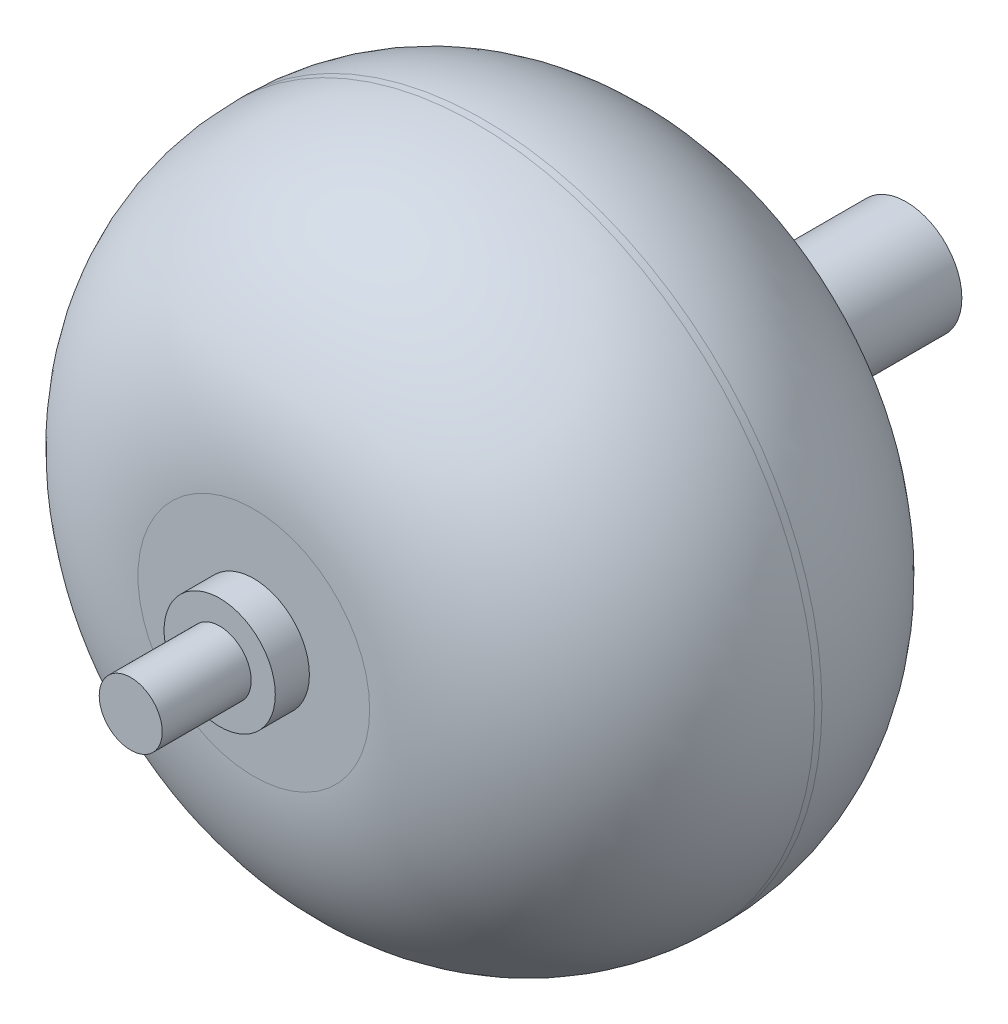
ISO-10303-21;
HEADER;
FILE_DESCRIPTION(('STEP AP214'),'2;1');
FILE_NAME('part.step','',(''),(''),'','','');
FILE_SCHEMA(('AUTOMOTIVE_DESIGN { 1 0 10303 214 1 1 1 1 }'));
ENDSEC;
DATA;
#1=APPLICATION_CONTEXT('core data for automotive mechanical design processes');
#2=APPLICATION_PROTOCOL_DEFINITION('international standard','automotive_design',2000,#1);
#3=PRODUCT_CONTEXT('',#1,'mechanical');
#4=PRODUCT('Part','Part','',(#3));
#5=PRODUCT_RELATED_PRODUCT_CATEGORY('part','',(#4));
#6=PRODUCT_DEFINITION_FORMATION('','',#4);
#7=PRODUCT_DEFINITION_CONTEXT('part definition',#1,'design');
#8=PRODUCT_DEFINITION('design','',#6,#7);
#9=PRODUCT_DEFINITION_SHAPE('','',#8);
#10=(LENGTH_UNIT() NAMED_UNIT(*) SI_UNIT(.MILLI.,.METRE.));
#11=(NAMED_UNIT(*) PLANE_ANGLE_UNIT() SI_UNIT($,.RADIAN.));
#12=(NAMED_UNIT(*) SI_UNIT($,.STERADIAN.) SOLID_ANGLE_UNIT());
#13=UNCERTAINTY_MEASURE_WITH_UNIT(LENGTH_MEASURE(1.E-05),#10,'distance_accuracy_value','');
#14=(GEOMETRIC_REPRESENTATION_CONTEXT(3) GLOBAL_UNCERTAINTY_ASSIGNED_CONTEXT((#13)) GLOBAL_UNIT_ASSIGNED_CONTEXT((#10,
#11,#12)) REPRESENTATION_CONTEXT('',''));
#15=CARTESIAN_POINT('',(0.,0.,0.));
#16=DIRECTION('',(0.,0.,1.));
#17=DIRECTION('',(1.,0.,0.));
#18=AXIS2_PLACEMENT_3D('',#15,#16,#17);
#19=CARTESIAN_POINT('',(0.,0.,12.2));
#20=DIRECTION('',(0.,0.,-1.));
#21=DIRECTION('',(-1.,0.,0.));
#22=AXIS2_PLACEMENT_3D('',#19,#20,#21);
#23=CYLINDRICAL_SURFACE('',#22,9.125);
#24=CARTESIAN_POINT('',(0.,0.,6.2));
#25=DIRECTION('',(0.,0.,1.));
#26=DIRECTION('',(1.,0.,0.));
#27=AXIS2_PLACEMENT_3D('',#24,#25,#26);
#28=CIRCLE('',#27,9.125);
#29=CARTESIAN_POINT('',(9.125,0.,6.2));
#30=VERTEX_POINT('',#29);
#31=EDGE_CURVE('E47',#30,#30,#28,.F.);
#32=ORIENTED_EDGE('',*,*,#31,.T.);
#33=EDGE_LOOP('',(#32));
#34=FACE_BOUND('',#33,.T.);
#35=CARTESIAN_POINT('',(0.,0.,6.));
#36=DIRECTION('',(0.,0.,1.));
#37=DIRECTION('',(1.,0.,0.));
#38=AXIS2_PLACEMENT_3D('',#35,#36,#37);
#39=CIRCLE('',#38,9.125);
#40=CARTESIAN_POINT('',(9.125,0.,6.));
#41=VERTEX_POINT('',#40);
#42=EDGE_CURVE('E51',#41,#41,#39,.T.);
#43=ORIENTED_EDGE('',*,*,#42,.T.);
#44=EDGE_LOOP('',(#43));
#45=FACE_BOUND('',#44,.T.);
#46=ADVANCED_FACE('F40',(#34,#45),#23,.T.);
#47=CARTESIAN_POINT('',(0.,0.,12.2));
#48=DIRECTION('',(0.,0.,1.));
#49=DIRECTION('',(1.,0.,0.));
#50=AXIS2_PLACEMENT_3D('',#47,#48,#49);
#51=PLANE('',#50);
#52=CARTESIAN_POINT('',(0.,0.,12.2));
#53=DIRECTION('',(0.,0.,1.));
#54=DIRECTION('',(1.,0.,0.));
#55=AXIS2_PLACEMENT_3D('',#52,#53,#54);
#56=CIRCLE('',#55,3.125);
#57=CARTESIAN_POINT('',(3.125,0.,12.2));
#58=VERTEX_POINT('',#57);
#59=EDGE_CURVE('E55',#58,#58,#56,.T.);
#60=ORIENTED_EDGE('',*,*,#59,.T.);
#61=EDGE_LOOP('',(#60));
#62=FACE_BOUND('',#61,.T.);
#63=CARTESIAN_POINT('',(0.,0.,12.2));
#64=DIRECTION('',(0.,0.,1.));
#65=DIRECTION('',(1.,0.,0.));
#66=AXIS2_PLACEMENT_3D('',#63,#64,#65);
#67=CIRCLE('',#66,1.5);
#68=CARTESIAN_POINT('',(1.5,0.,12.2));
#69=VERTEX_POINT('',#68);
#70=EDGE_CURVE('E60',#69,#69,#67,.T.);
#71=ORIENTED_EDGE('',*,*,#70,.F.);
#72=EDGE_LOOP('',(#71));
#73=FACE_BOUND('',#72,.T.);
#74=ADVANCED_FACE('F97',(#62,#73),#51,.T.);
#75=CARTESIAN_POINT('',(0.,0.,0.));
#76=DIRECTION('',(0.,0.,1.));
#77=DIRECTION('',(1.,0.,0.));
#78=AXIS2_PLACEMENT_3D('',#75,#76,#77);
#79=PLANE('',#78);
#80=CARTESIAN_POINT('',(0.,0.,0.));
#81=DIRECTION('',(0.,0.,1.));
#82=DIRECTION('',(1.,0.,0.));
#83=AXIS2_PLACEMENT_3D('',#80,#81,#82);
#84=CIRCLE('',#83,3.125);
#85=CARTESIAN_POINT('',(3.125,0.,0.));
#86=VERTEX_POINT('',#85);
#87=EDGE_CURVE('E10',#86,#86,#84,.F.);
#88=ORIENTED_EDGE('',*,*,#87,.T.);
#89=EDGE_LOOP('',(#88));
#90=FACE_BOUND('',#89,.T.);
#91=CARTESIAN_POINT('',(0.,0.,0.));
#92=DIRECTION('',(0.,0.,-1.));
#93=DIRECTION('',(-1.,0.,0.));
#94=AXIS2_PLACEMENT_3D('',#91,#92,#93);
#95=CIRCLE('',#94,1.5);
#96=CARTESIAN_POINT('',(1.5,0.,0.));
#97=VERTEX_POINT('',#96);
#98=EDGE_CURVE('E66',#97,#97,#95,.T.);
#99=ORIENTED_EDGE('',*,*,#98,.F.);
#100=EDGE_LOOP('',(#99));
#101=FACE_BOUND('',#100,.T.);
#102=ADVANCED_FACE('F103',(#90,#101),#79,.F.);
#103=CARTESIAN_POINT('',(0.,0.,-5.4));
#104=DIRECTION('',(0.,0.,1.));
#105=DIRECTION('',(1.,0.,0.));
#106=AXIS2_PLACEMENT_3D('',#103,#104,#105);
#107=CYLINDRICAL_SURFACE('',#106,1.5);
#108=CARTESIAN_POINT('',(0.,0.,-5.4));
#109=DIRECTION('',(0.,0.,-1.));
#110=DIRECTION('',(-1.,0.,0.));
#111=AXIS2_PLACEMENT_3D('',#108,#109,#110);
#112=CIRCLE('',#111,1.5);
#113=CARTESIAN_POINT('',(1.5,0.,-5.4));
#114=VERTEX_POINT('',#113);
#115=EDGE_CURVE('E69',#114,#114,#112,.T.);
#116=CARTESIAN_POINT('',(1.5,0.,-5.4));
#117=CARTESIAN_POINT('',(1.5,0.,-5.34375));
#118=CARTESIAN_POINT('',(1.5,0.,-5.2875));
#119=CARTESIAN_POINT('',(1.5,0.,-5.175));
#120=CARTESIAN_POINT('',(1.5,0.,-5.11875));
#121=CARTESIAN_POINT('',(1.5,0.,-5.00625));
#122=CARTESIAN_POINT('',(1.5,0.,-4.95));
#123=CARTESIAN_POINT('',(1.5,0.,-4.8375));
#124=CARTESIAN_POINT('',(1.5,0.,-4.78125));
#125=CARTESIAN_POINT('',(1.5,0.,-4.66875));
#126=CARTESIAN_POINT('',(1.5,0.,-4.6125));
#127=CARTESIAN_POINT('',(1.5,0.,-4.5));
#128=CARTESIAN_POINT('',(1.5,0.,-4.44375));
#129=CARTESIAN_POINT('',(1.5,0.,-4.33125));
#130=CARTESIAN_POINT('',(1.5,0.,-4.275));
#131=CARTESIAN_POINT('',(1.5,0.,-4.1625));
#132=CARTESIAN_POINT('',(1.5,0.,-4.10625));
#133=CARTESIAN_POINT('',(1.5,0.,-3.99375));
#134=CARTESIAN_POINT('',(1.5,0.,-3.9375));
#135=CARTESIAN_POINT('',(1.5,0.,-3.825));
#136=CARTESIAN_POINT('',(1.5,0.,-3.76875));
#137=CARTESIAN_POINT('',(1.5,0.,-3.65625));
#138=CARTESIAN_POINT('',(1.5,0.,-3.6));
#139=CARTESIAN_POINT('',(1.5,0.,-3.4875));
#140=CARTESIAN_POINT('',(1.5,0.,-3.43125));
#141=CARTESIAN_POINT('',(1.5,0.,-3.31875));
#142=CARTESIAN_POINT('',(1.5,0.,-3.2625));
#143=CARTESIAN_POINT('',(1.5,0.,-3.15));
#144=CARTESIAN_POINT('',(1.5,0.,-3.09375));
#145=CARTESIAN_POINT('',(1.5,0.,-2.98125));
#146=CARTESIAN_POINT('',(1.5,0.,-2.925));
#147=CARTESIAN_POINT('',(1.5,0.,-2.8125));
#148=CARTESIAN_POINT('',(1.5,0.,-2.75625));
#149=CARTESIAN_POINT('',(1.5,0.,-2.64375));
#150=CARTESIAN_POINT('',(1.5,0.,-2.5875));
#151=CARTESIAN_POINT('',(1.5,0.,-2.475));
#152=CARTESIAN_POINT('',(1.5,0.,-2.41875));
#153=CARTESIAN_POINT('',(1.5,0.,-2.30625));
#154=CARTESIAN_POINT('',(1.5,0.,-2.25));
#155=CARTESIAN_POINT('',(1.5,0.,-2.1375));
#156=CARTESIAN_POINT('',(1.5,0.,-2.08125));
#157=CARTESIAN_POINT('',(1.5,0.,-1.96875));
#158=CARTESIAN_POINT('',(1.5,0.,-1.9125));
#159=CARTESIAN_POINT('',(1.5,0.,-1.8));
#160=CARTESIAN_POINT('',(1.5,0.,-1.74375));
#161=CARTESIAN_POINT('',(1.5,0.,-1.63125));
#162=CARTESIAN_POINT('',(1.5,0.,-1.575));
#163=CARTESIAN_POINT('',(1.5,0.,-1.4625));
#164=CARTESIAN_POINT('',(1.5,0.,-1.40625));
#165=CARTESIAN_POINT('',(1.5,0.,-1.29375));
#166=CARTESIAN_POINT('',(1.5,0.,-1.2375));
#167=CARTESIAN_POINT('',(1.5,0.,-1.125));
#168=CARTESIAN_POINT('',(1.5,0.,-1.06875));
#169=CARTESIAN_POINT('',(1.5,0.,-0.95625));
#170=CARTESIAN_POINT('',(1.5,0.,-0.9));
#171=CARTESIAN_POINT('',(1.5,0.,-0.7875));
#172=CARTESIAN_POINT('',(1.5,0.,-0.73125));
#173=CARTESIAN_POINT('',(1.5,0.,-0.618749999999999));
#174=CARTESIAN_POINT('',(1.5,0.,-0.562499999999999));
#175=CARTESIAN_POINT('',(1.5,0.,-0.449999999999999));
#176=CARTESIAN_POINT('',(1.5,0.,-0.393749999999999));
#177=CARTESIAN_POINT('',(1.5,0.,-0.281249999999999));
#178=CARTESIAN_POINT('',(1.5,0.,-0.225));
#179=CARTESIAN_POINT('',(1.5,0.,-0.112499999999999));
#180=CARTESIAN_POINT('',(1.5,0.,-0.0562499999999992));
#181=CARTESIAN_POINT('',(1.5,0.,0.));
#182=B_SPLINE_CURVE_WITH_KNOTS('',3,(#116,#117,#118,#119,#120,#121,#122,#123,#124,#125,#126,
#127,#128,#129,#130,#131,#132,#133,#134,#135,#136,#137,#138,#139,#140,#141,#142,#143,#144,#145,
#146,#147,#148,#149,#150,#151,#152,#153,#154,#155,#156,#157,#158,#159,#160,#161,#162,#163,#164,
#165,#166,#167,#168,#169,#170,#171,#172,#173,#174,#175,#176,#177,#178,#179,#180,#181),
.UNSPECIFIED.,.F.,.F.,(4,2,2,2,2,2,2,2,2,2,2,2,2,2,2,2,2,2,2,2,2,2,2,2,2,2,2,2,2,2,2,2,4),(0.,
0.168750000000001,0.3375,0.506250000000001,0.675,0.843750000000001,1.0125,1.18125,1.35,1.51875,
1.6875,1.85625,2.025,2.19375,2.3625,2.53125,2.7,2.86875,3.0375,3.20625,3.375,3.54375,3.7125,
3.88125,4.05,4.21875,4.3875,4.55625,4.725,4.89375,5.0625,5.23125,5.4),.UNSPECIFIED.);
#183=EDGE_CURVE('BSEAM126',#114,#97,#182,.T.);
#184=ORIENTED_EDGE('',*,*,#115,.F.);
#185=ORIENTED_EDGE('',*,*,#98,.T.);
#186=ORIENTED_EDGE('',*,*,#183,.T.);
#187=ORIENTED_EDGE('',*,*,#183,.F.);
#188=EDGE_LOOP('',(#184,#186,#185,#187));
#189=FACE_BOUND('',#188,.T.);
#190=ADVANCED_FACE('F126',(#189),#107,.T.);
#191=CARTESIAN_POINT('',(0.,0.,-5.4));
#192=DIRECTION('',(0.,0.,-1.));
#193=DIRECTION('',(-1.,0.,0.));
#194=AXIS2_PLACEMENT_3D('',#191,#192,#193);
#195=PLANE('',#194);
#196=ORIENTED_EDGE('',*,*,#115,.T.);
#197=EDGE_LOOP('',(#196));
#198=FACE_BOUND('',#197,.T.);
#199=ADVANCED_FACE('F120',(#198),#195,.T.);
#200=CARTESIAN_POINT('',(0.,0.,13.12));
#201=DIRECTION('',(0.,0.,-1.));
#202=DIRECTION('',(-1.,0.,0.));
#203=AXIS2_PLACEMENT_3D('',#200,#201,#202);
#204=CYLINDRICAL_SURFACE('',#203,1.5);
#205=CARTESIAN_POINT('',(0.,0.,13.12));
#206=DIRECTION('',(0.,0.,1.));
#207=DIRECTION('',(1.,0.,0.));
#208=AXIS2_PLACEMENT_3D('',#205,#206,#207);
#209=CIRCLE('',#208,1.5);
#210=CARTESIAN_POINT('',(1.5,0.,13.12));
#211=VERTEX_POINT('',#210);
#212=EDGE_CURVE('E64',#211,#211,#209,.T.);
#213=ORIENTED_EDGE('',*,*,#212,.F.);
#214=EDGE_LOOP('',(#213));
#215=FACE_BOUND('',#214,.T.);
#216=ORIENTED_EDGE('',*,*,#70,.T.);
#217=EDGE_LOOP('',(#216));
#218=FACE_BOUND('',#217,.T.);
#219=ADVANCED_FACE('F92',(#215,#218),#204,.T.);
#220=CARTESIAN_POINT('',(0.,0.,13.12));
#221=DIRECTION('',(0.,0.,1.));
#222=DIRECTION('',(1.,0.,0.));
#223=AXIS2_PLACEMENT_3D('',#220,#221,#222);
#224=PLANE('',#223);
#225=CARTESIAN_POINT('',(0.,0.,13.12));
#226=DIRECTION('',(0.,0.,1.));
#227=DIRECTION('',(1.,0.,0.));
#228=AXIS2_PLACEMENT_3D('',#225,#226,#227);
#229=CIRCLE('',#228,0.85);
#230=CARTESIAN_POINT('',(-0.85,0.,13.12));
#231=VERTEX_POINT('',#230);
#232=EDGE_CURVE('E61',#231,#231,#229,.F.);
#233=ORIENTED_EDGE('',*,*,#232,.T.);
#234=EDGE_LOOP('',(#233));
#235=FACE_BOUND('',#234,.T.);
#236=ORIENTED_EDGE('',*,*,#212,.T.);
#237=EDGE_LOOP('',(#236));
#238=FACE_BOUND('',#237,.T.);
#239=ADVANCED_FACE('F83',(#235,#238),#224,.T.);
#240=CARTESIAN_POINT('',(0.,0.,15.52));
#241=DIRECTION('',(0.,0.,-1.));
#242=DIRECTION('',(-1.,0.,0.));
#243=AXIS2_PLACEMENT_3D('',#240,#241,#242);
#244=CYLINDRICAL_SURFACE('',#243,0.85);
#245=CARTESIAN_POINT('',(0.,0.,15.52));
#246=DIRECTION('',(0.,0.,1.));
#247=DIRECTION('',(1.,0.,0.));
#248=AXIS2_PLACEMENT_3D('',#245,#246,#247);
#249=CIRCLE('',#248,0.85);
#250=CARTESIAN_POINT('',(-0.85,0.,15.52));
#251=VERTEX_POINT('',#250);
#252=EDGE_CURVE('E65',#251,#251,#249,.T.);
#253=CARTESIAN_POINT('',(-0.85,0.,13.12));
#254=CARTESIAN_POINT('',(-0.85,0.,13.145));
#255=CARTESIAN_POINT('',(-0.85,0.,13.17));
#256=CARTESIAN_POINT('',(-0.85,0.,13.22));
#257=CARTESIAN_POINT('',(-0.85,0.,13.245));
#258=CARTESIAN_POINT('',(-0.85,0.,13.295));
#259=CARTESIAN_POINT('',(-0.85,0.,13.32));
#260=CARTESIAN_POINT('',(-0.85,0.,13.37));
#261=CARTESIAN_POINT('',(-0.85,0.,13.395));
#262=CARTESIAN_POINT('',(-0.85,0.,13.445));
#263=CARTESIAN_POINT('',(-0.85,0.,13.47));
#264=CARTESIAN_POINT('',(-0.85,0.,13.52));
#265=CARTESIAN_POINT('',(-0.85,0.,13.545));
#266=CARTESIAN_POINT('',(-0.85,0.,13.595));
#267=CARTESIAN_POINT('',(-0.85,0.,13.62));
#268=CARTESIAN_POINT('',(-0.85,0.,13.67));
#269=CARTESIAN_POINT('',(-0.85,0.,13.695));
#270=CARTESIAN_POINT('',(-0.85,0.,13.745));
#271=CARTESIAN_POINT('',(-0.85,0.,13.77));
#272=CARTESIAN_POINT('',(-0.85,0.,13.82));
#273=CARTESIAN_POINT('',(-0.85,0.,13.845));
#274=CARTESIAN_POINT('',(-0.85,0.,13.895));
#275=CARTESIAN_POINT('',(-0.85,0.,13.92));
#276=CARTESIAN_POINT('',(-0.85,0.,13.97));
#277=CARTESIAN_POINT('',(-0.85,0.,13.995));
#278=CARTESIAN_POINT('',(-0.85,0.,14.045));
#279=CARTESIAN_POINT('',(-0.85,0.,14.07));
#280=CARTESIAN_POINT('',(-0.85,0.,14.12));
#281=CARTESIAN_POINT('',(-0.85,0.,14.145));
#282=CARTESIAN_POINT('',(-0.85,0.,14.195));
#283=CARTESIAN_POINT('',(-0.85,0.,14.22));
#284=CARTESIAN_POINT('',(-0.85,0.,14.27));
#285=CARTESIAN_POINT('',(-0.85,0.,14.295));
#286=CARTESIAN_POINT('',(-0.85,0.,14.345));
#287=CARTESIAN_POINT('',(-0.85,0.,14.37));
#288=CARTESIAN_POINT('',(-0.85,0.,14.42));
#289=CARTESIAN_POINT('',(-0.85,0.,14.445));
#290=CARTESIAN_POINT('',(-0.85,0.,14.495));
#291=CARTESIAN_POINT('',(-0.85,0.,14.52));
#292=CARTESIAN_POINT('',(-0.85,0.,14.57));
#293=CARTESIAN_POINT('',(-0.85,0.,14.595));
#294=CARTESIAN_POINT('',(-0.85,0.,14.645));
#295=CARTESIAN_POINT('',(-0.85,0.,14.67));
#296=CARTESIAN_POINT('',(-0.85,0.,14.72));
#297=CARTESIAN_POINT('',(-0.85,0.,14.745));
#298=CARTESIAN_POINT('',(-0.85,0.,14.795));
#299=CARTESIAN_POINT('',(-0.85,0.,14.82));
#300=CARTESIAN_POINT('',(-0.85,0.,14.87));
#301=CARTESIAN_POINT('',(-0.85,0.,14.895));
#302=CARTESIAN_POINT('',(-0.85,0.,14.945));
#303=CARTESIAN_POINT('',(-0.85,0.,14.97));
#304=CARTESIAN_POINT('',(-0.85,0.,15.02));
#305=CARTESIAN_POINT('',(-0.85,0.,15.045));
#306=CARTESIAN_POINT('',(-0.85,0.,15.095));
#307=CARTESIAN_POINT('',(-0.85,0.,15.12));
#308=CARTESIAN_POINT('',(-0.85,0.,15.17));
#309=CARTESIAN_POINT('',(-0.85,0.,15.195));
#310=CARTESIAN_POINT('',(-0.85,0.,15.245));
#311=CARTESIAN_POINT('',(-0.85,0.,15.27));
#312=CARTESIAN_POINT('',(-0.85,0.,15.32));
#313=CARTESIAN_POINT('',(-0.85,0.,15.345));
#314=CARTESIAN_POINT('',(-0.85,0.,15.395));
#315=CARTESIAN_POINT('',(-0.85,0.,15.42));
#316=CARTESIAN_POINT('',(-0.85,0.,15.47));
#317=CARTESIAN_POINT('',(-0.85,0.,15.495));
#318=CARTESIAN_POINT('',(-0.85,0.,15.52));
#319=B_SPLINE_CURVE_WITH_KNOTS('',3,(#253,#254,#255,#256,#257,#258,#259,#260,#261,#262,#263,
#264,#265,#266,#267,#268,#269,#270,#271,#272,#273,#274,#275,#276,#277,#278,#279,#280,#281,#282,
#283,#284,#285,#286,#287,#288,#289,#290,#291,#292,#293,#294,#295,#296,#297,#298,#299,#300,#301,
#302,#303,#304,#305,#306,#307,#308,#309,#310,#311,#312,#313,#314,#315,#316,#317,#318),
.UNSPECIFIED.,.F.,.F.,(4,2,2,2,2,2,2,2,2,2,2,2,2,2,2,2,2,2,2,2,2,2,2,2,2,2,2,2,2,2,2,2,4),(0.,
0.0750000000000004,0.150000000000001,0.225000000000001,0.3,0.375,0.450000000000001,
0.524999999999999,0.6,0.675,0.750000000000001,0.825000000000001,0.9,0.975,1.05,1.125,1.2,1.275,
1.35,1.425,1.5,1.575,1.65,1.725,1.8,1.875,1.95,2.025,2.1,2.175,2.25,2.325,2.4),.UNSPECIFIED.);
#320=EDGE_CURVE('BSEAM81',#231,#251,#319,.T.);
#321=ORIENTED_EDGE('',*,*,#232,.F.);
#322=ORIENTED_EDGE('',*,*,#252,.F.);
#323=ORIENTED_EDGE('',*,*,#320,.T.);
#324=ORIENTED_EDGE('',*,*,#320,.F.);
#325=EDGE_LOOP('',(#321,#323,#322,#324));
#326=FACE_BOUND('',#325,.T.);
#327=ADVANCED_FACE('F81',(#326),#244,.T.);
#328=CARTESIAN_POINT('',(0.,0.,15.52));
#329=DIRECTION('',(0.,0.,1.));
#330=DIRECTION('',(1.,0.,0.));
#331=AXIS2_PLACEMENT_3D('',#328,#329,#330);
#332=PLANE('',#331);
#333=ORIENTED_EDGE('',*,*,#252,.T.);
#334=EDGE_LOOP('',(#333));
#335=FACE_BOUND('',#334,.T.);
#336=ADVANCED_FACE('F79',(#335),#332,.T.);
#337=CARTESIAN_POINT('',(0.,0.,6.2));
#338=DIRECTION('',(0.,0.,1.));
#339=DIRECTION('',(1.,0.,0.));
#340=AXIS2_PLACEMENT_3D('',#337,#338,#339);
#341=DEGENERATE_TOROIDAL_SURFACE('',#340,3.125,6.,.T.);
#342=ORIENTED_EDGE('',*,*,#31,.F.);
#343=EDGE_LOOP('',(#342));
#344=FACE_BOUND('',#343,.T.);
#345=ORIENTED_EDGE('',*,*,#59,.F.);
#346=EDGE_LOOP('',(#345));
#347=FACE_BOUND('',#346,.T.);
#348=ADVANCED_FACE('F90',(#344,#347),#341,.T.);
#349=CARTESIAN_POINT('',(0.,0.,6.));
#350=DIRECTION('',(0.,0.,1.));
#351=DIRECTION('',(1.,0.,0.));
#352=AXIS2_PLACEMENT_3D('',#349,#350,#351);
#353=DEGENERATE_TOROIDAL_SURFACE('',#352,3.125,6.,.T.);
#354=ORIENTED_EDGE('',*,*,#87,.F.);
#355=EDGE_LOOP('',(#354));
#356=FACE_BOUND('',#355,.T.);
#357=ORIENTED_EDGE('',*,*,#42,.F.);
#358=EDGE_LOOP('',(#357));
#359=FACE_BOUND('',#358,.T.);
#360=ADVANCED_FACE('F42',(#356,#359),#353,.T.);
#361=CLOSED_SHELL('',(#46,#74,#102,#190,#199,#219,#239,#327,#336,#348,#360));
#362=MANIFOLD_SOLID_BREP('B2',#361);
#363=ADVANCED_BREP_SHAPE_REPRESENTATION('',(#18,#362),#14);
#364=SHAPE_DEFINITION_REPRESENTATION(#9,#363);
ENDSEC;
END-ISO-10303-21;
